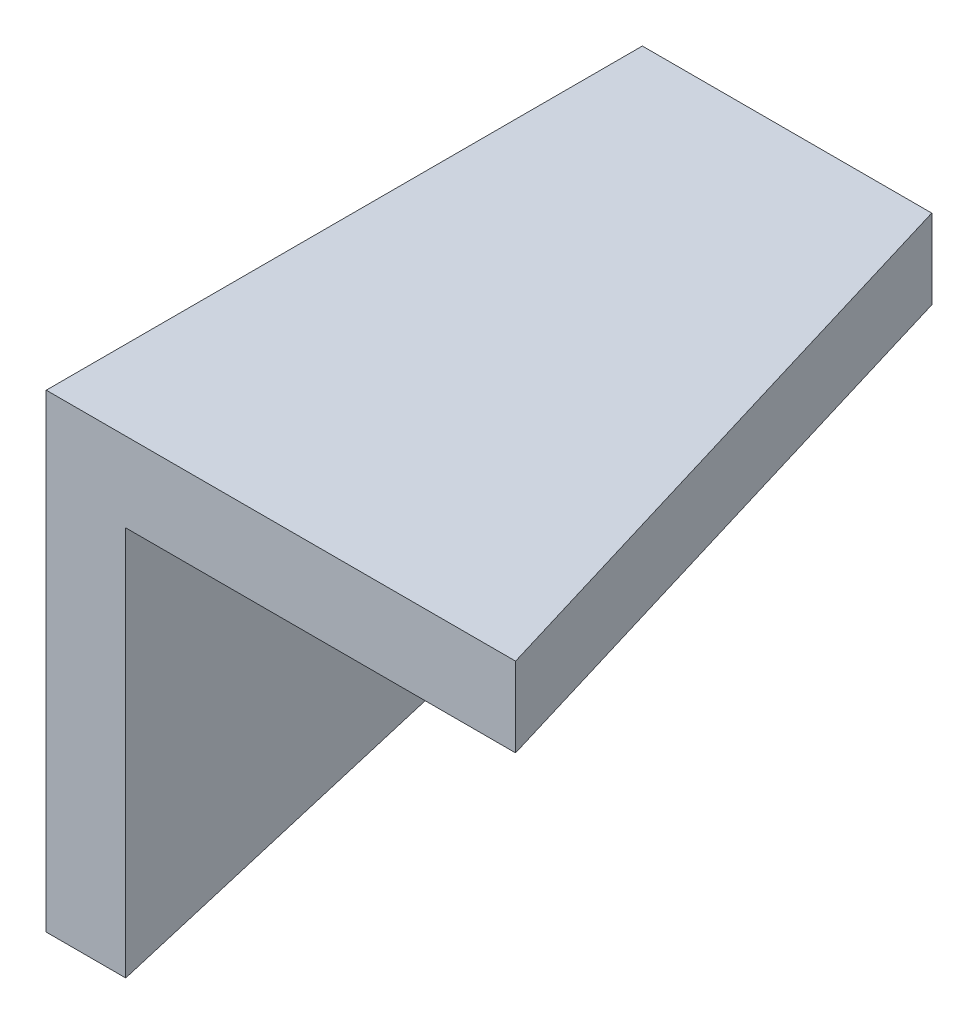
ISO-10303-21;
HEADER;
FILE_DESCRIPTION(('STEP AP214'),'2;1');
FILE_NAME('part.step','',(''),(''),'','','');
FILE_SCHEMA(('AUTOMOTIVE_DESIGN { 1 0 10303 214 1 1 1 1 }'));
ENDSEC;
DATA;
#1=APPLICATION_CONTEXT('core data for automotive mechanical design processes');
#2=APPLICATION_PROTOCOL_DEFINITION('international standard','automotive_design',2000,#1);
#3=PRODUCT_CONTEXT('',#1,'mechanical');
#4=PRODUCT('Part','Part','',(#3));
#5=PRODUCT_RELATED_PRODUCT_CATEGORY('part','',(#4));
#6=PRODUCT_DEFINITION_FORMATION('','',#4);
#7=PRODUCT_DEFINITION_CONTEXT('part definition',#1,'design');
#8=PRODUCT_DEFINITION('design','',#6,#7);
#9=PRODUCT_DEFINITION_SHAPE('','',#8);
#10=(LENGTH_UNIT() NAMED_UNIT(*) SI_UNIT(.MILLI.,.METRE.));
#11=(NAMED_UNIT(*) PLANE_ANGLE_UNIT() SI_UNIT($,.RADIAN.));
#12=(NAMED_UNIT(*) SI_UNIT($,.STERADIAN.) SOLID_ANGLE_UNIT());
#13=UNCERTAINTY_MEASURE_WITH_UNIT(LENGTH_MEASURE(1.E-05),#10,'distance_accuracy_value','');
#14=(GEOMETRIC_REPRESENTATION_CONTEXT(3) GLOBAL_UNCERTAINTY_ASSIGNED_CONTEXT((#13)) GLOBAL_UNIT_ASSIGNED_CONTEXT((#10,
#11,#12)) REPRESENTATION_CONTEXT('',''));
#15=CARTESIAN_POINT('',(0.,0.,0.));
#16=DIRECTION('',(0.,0.,1.));
#17=DIRECTION('',(1.,0.,0.));
#18=AXIS2_PLACEMENT_3D('',#15,#16,#17);
#19=CARTESIAN_POINT('',(40.,8.,30.));
#20=DIRECTION('',(0.,-1.,0.));
#21=DIRECTION('',(0.,0.,-1.));
#22=AXIS2_PLACEMENT_3D('',#19,#20,#21);
#23=PLANE('',#22);
#24=DIRECTION('',(-1.,0.,0.));
#25=VECTOR('',#24,1.);
#26=CARTESIAN_POINT('',(40.,8.,30.));
#27=LINE('',#26,#25);
#28=CARTESIAN_POINT('',(39.2402430588096,8.,30.));
#29=VERTEX_POINT('',#28);
#30=CARTESIAN_POINT('',(-8.,8.,30.));
#31=VERTEX_POINT('',#30);
#32=EDGE_CURVE('E139',#29,#31,#27,.T.);
#33=ORIENTED_EDGE('',*,*,#32,.F.);
#34=DIRECTION('',(-0.288970576767616,0.,-0.957337978857306));
#35=VECTOR('',#34,1.);
#36=CARTESIAN_POINT('',(39.3036857980486,8.,30.2101810656144));
#37=LINE('',#36,#35);
#38=CARTESIAN_POINT('',(21.1293616470514,8.,-30.));
#39=VERTEX_POINT('',#38);
#40=EDGE_CURVE('E136',#29,#39,#37,.T.);
#41=ORIENTED_EDGE('',*,*,#40,.T.);
#42=DIRECTION('',(-1.,0.,0.));
#43=VECTOR('',#42,1.);
#44=CARTESIAN_POINT('',(40.,8.,-30.));
#45=LINE('',#44,#43);
#46=CARTESIAN_POINT('',(-8.,8.,-30.));
#47=VERTEX_POINT('',#46);
#48=EDGE_CURVE('E138',#39,#47,#45,.T.);
#49=ORIENTED_EDGE('',*,*,#48,.T.);
#50=DIRECTION('',(0.,0.,-1.));
#51=VECTOR('',#50,1.);
#52=CARTESIAN_POINT('',(-8.,8.,30.));
#53=LINE('',#52,#51);
#54=EDGE_CURVE('E120',#31,#47,#53,.T.);
#55=ORIENTED_EDGE('',*,*,#54,.F.);
#56=EDGE_LOOP('',(#33,#41,#49,#55));
#57=FACE_BOUND('',#56,.T.);
#58=ADVANCED_FACE('F47',(#57),#23,.F.);
#59=CARTESIAN_POINT('',(40.,0.,30.));
#60=DIRECTION('',(0.,1.,0.));
#61=DIRECTION('',(0.,0.,1.));
#62=AXIS2_PLACEMENT_3D('',#59,#60,#61);
#63=PLANE('',#62);
#64=DIRECTION('',(1.,0.,0.));
#65=VECTOR('',#64,1.);
#66=CARTESIAN_POINT('',(40.,0.,-30.));
#67=LINE('',#66,#65);
#68=CARTESIAN_POINT('',(0.,0.,-30.));
#69=VERTEX_POINT('',#68);
#70=CARTESIAN_POINT('',(21.1293616470514,0.,-30.));
#71=VERTEX_POINT('',#70);
#72=EDGE_CURVE('E141',#69,#71,#67,.T.);
#73=ORIENTED_EDGE('',*,*,#72,.T.);
#74=DIRECTION('',(-0.288970576767616,0.,-0.957337978857306));
#75=VECTOR('',#74,1.);
#76=CARTESIAN_POINT('',(39.2402430588096,0.,30.));
#77=LINE('',#76,#75);
#78=CARTESIAN_POINT('',(39.2402430588096,0.,30.));
#79=VERTEX_POINT('',#78);
#80=EDGE_CURVE('E61',#79,#71,#77,.T.);
#81=ORIENTED_EDGE('',*,*,#80,.F.);
#82=DIRECTION('',(1.,0.,0.));
#83=VECTOR('',#82,1.);
#84=CARTESIAN_POINT('',(40.,0.,30.));
#85=LINE('',#84,#83);
#86=CARTESIAN_POINT('',(0.,0.,30.));
#87=VERTEX_POINT('',#86);
#88=EDGE_CURVE('E54',#87,#79,#85,.T.);
#89=ORIENTED_EDGE('',*,*,#88,.F.);
#90=DIRECTION('',(0.,0.,-1.));
#91=VECTOR('',#90,1.);
#92=CARTESIAN_POINT('',(0.,0.,30.));
#93=LINE('',#92,#91);
#94=EDGE_CURVE('E118',#87,#69,#93,.T.);
#95=ORIENTED_EDGE('',*,*,#94,.T.);
#96=EDGE_LOOP('',(#73,#81,#89,#95));
#97=FACE_BOUND('',#96,.T.);
#98=ADVANCED_FACE('F146',(#97),#63,.F.);
#99=CARTESIAN_POINT('',(0.,0.,30.));
#100=DIRECTION('',(0.,0.,1.));
#101=DIRECTION('',(1.,0.,0.));
#102=AXIS2_PLACEMENT_3D('',#99,#100,#101);
#103=PLANE('',#102);
#104=ORIENTED_EDGE('',*,*,#32,.T.);
#105=DIRECTION('',(0.,1.,0.));
#106=VECTOR('',#105,1.);
#107=CARTESIAN_POINT('',(-8.00000000000001,-40.,30.));
#108=LINE('',#107,#106);
#109=CARTESIAN_POINT('',(-8.00000000000001,-39.2402430588096,30.));
#110=VERTEX_POINT('',#109);
#111=EDGE_CURVE('E103',#110,#31,#108,.T.);
#112=ORIENTED_EDGE('',*,*,#111,.F.);
#113=DIRECTION('',(1.,0.,0.));
#114=VECTOR('',#113,1.);
#115=CARTESIAN_POINT('',(-10.,-39.2402430588096,30.));
#116=LINE('',#115,#114);
#117=CARTESIAN_POINT('',(0.,-39.2402430588096,30.));
#118=VERTEX_POINT('',#117);
#119=EDGE_CURVE('E95',#110,#118,#116,.T.);
#120=ORIENTED_EDGE('',*,*,#119,.T.);
#121=DIRECTION('',(0.,-1.,0.));
#122=VECTOR('',#121,1.);
#123=CARTESIAN_POINT('',(0.,-40.,30.));
#124=LINE('',#123,#122);
#125=EDGE_CURVE('E100',#87,#118,#124,.T.);
#126=ORIENTED_EDGE('',*,*,#125,.F.);
#127=ORIENTED_EDGE('',*,*,#88,.T.);
#128=DIRECTION('',(0.,-1.,0.));
#129=VECTOR('',#128,1.);
#130=CARTESIAN_POINT('',(39.2402430588096,10.,30.));
#131=LINE('',#130,#129);
#132=EDGE_CURVE('E134',#29,#79,#131,.T.);
#133=ORIENTED_EDGE('',*,*,#132,.F.);
#134=EDGE_LOOP('',(#104,#112,#120,#126,#127,#133));
#135=FACE_BOUND('',#134,.T.);
#136=ADVANCED_FACE('F97',(#135),#103,.T.);
#137=CARTESIAN_POINT('',(0.,0.,-30.));
#138=DIRECTION('',(0.,0.,1.));
#139=DIRECTION('',(1.,0.,0.));
#140=AXIS2_PLACEMENT_3D('',#137,#138,#139);
#141=PLANE('',#140);
#142=ORIENTED_EDGE('',*,*,#72,.F.);
#143=DIRECTION('',(0.,-1.,0.));
#144=VECTOR('',#143,1.);
#145=CARTESIAN_POINT('',(0.,-40.,-30.));
#146=LINE('',#145,#144);
#147=CARTESIAN_POINT('',(0.,-21.1293616470514,-30.));
#148=VERTEX_POINT('',#147);
#149=EDGE_CURVE('E122',#69,#148,#146,.T.);
#150=ORIENTED_EDGE('',*,*,#149,.T.);
#151=DIRECTION('',(1.,0.,0.));
#152=VECTOR('',#151,1.);
#153=CARTESIAN_POINT('',(0.,-21.1293616470514,-30.));
#154=LINE('',#153,#152);
#155=CARTESIAN_POINT('',(-8.00000000000001,-21.1293616470514,-30.));
#156=VERTEX_POINT('',#155);
#157=EDGE_CURVE('E112',#156,#148,#154,.T.);
#158=ORIENTED_EDGE('',*,*,#157,.F.);
#159=DIRECTION('',(0.,1.,0.));
#160=VECTOR('',#159,1.);
#161=CARTESIAN_POINT('',(-8.00000000000001,-40.,-30.));
#162=LINE('',#161,#160);
#163=EDGE_CURVE('E126',#156,#47,#162,.T.);
#164=ORIENTED_EDGE('',*,*,#163,.T.);
#165=ORIENTED_EDGE('',*,*,#48,.F.);
#166=DIRECTION('',(0.,-1.,0.));
#167=VECTOR('',#166,1.);
#168=CARTESIAN_POINT('',(21.1293616470514,0.,-30.));
#169=LINE('',#168,#167);
#170=EDGE_CURVE('E11',#39,#71,#169,.T.);
#171=ORIENTED_EDGE('',*,*,#170,.T.);
#172=EDGE_LOOP('',(#142,#150,#158,#164,#165,#171));
#173=FACE_BOUND('',#172,.T.);
#174=ADVANCED_FACE('F148',(#173),#141,.F.);
#175=CARTESIAN_POINT('',(39.2402430588096,10.,30.));
#176=DIRECTION('',(-0.957337978857306,0.,0.288970576767616));
#177=DIRECTION('',(0.288970576767616,0.,0.957337978857306));
#178=AXIS2_PLACEMENT_3D('',#175,#176,#177);
#179=PLANE('',#178);
#180=ORIENTED_EDGE('',*,*,#132,.T.);
#181=ORIENTED_EDGE('',*,*,#80,.T.);
#182=ORIENTED_EDGE('',*,*,#170,.F.);
#183=ORIENTED_EDGE('',*,*,#40,.F.);
#184=EDGE_LOOP('',(#180,#181,#182,#183));
#185=FACE_BOUND('',#184,.T.);
#186=ADVANCED_FACE('F155',(#185),#179,.F.);
#187=CARTESIAN_POINT('',(-8.00000000000001,-40.,30.));
#188=DIRECTION('',(1.,0.,0.));
#189=DIRECTION('',(0.,0.,-1.));
#190=AXIS2_PLACEMENT_3D('',#187,#188,#189);
#191=PLANE('',#190);
#192=ORIENTED_EDGE('',*,*,#111,.T.);
#193=ORIENTED_EDGE('',*,*,#54,.T.);
#194=ORIENTED_EDGE('',*,*,#163,.F.);
#195=DIRECTION('',(0.,0.288970576767616,-0.957337978857306));
#196=VECTOR('',#195,1.);
#197=CARTESIAN_POINT('',(-8.00000000000001,-39.3036857980486,30.2101810656144));
#198=LINE('',#197,#196);
#199=EDGE_CURVE('E107',#110,#156,#198,.T.);
#200=ORIENTED_EDGE('',*,*,#199,.F.);
#201=EDGE_LOOP('',(#192,#193,#194,#200));
#202=FACE_BOUND('',#201,.T.);
#203=ADVANCED_FACE('F157',(#202),#191,.F.);
#204=CARTESIAN_POINT('',(0.,-40.,30.));
#205=DIRECTION('',(-1.,0.,0.));
#206=DIRECTION('',(0.,0.,1.));
#207=AXIS2_PLACEMENT_3D('',#204,#205,#206);
#208=PLANE('',#207);
#209=ORIENTED_EDGE('',*,*,#149,.F.);
#210=ORIENTED_EDGE('',*,*,#94,.F.);
#211=ORIENTED_EDGE('',*,*,#125,.T.);
#212=DIRECTION('',(0.,0.288970576767616,-0.957337978857306));
#213=VECTOR('',#212,1.);
#214=CARTESIAN_POINT('',(0.,-39.2402430588096,30.));
#215=LINE('',#214,#213);
#216=EDGE_CURVE('E108',#118,#148,#215,.T.);
#217=ORIENTED_EDGE('',*,*,#216,.T.);
#218=EDGE_LOOP('',(#209,#210,#211,#217));
#219=FACE_BOUND('',#218,.T.);
#220=ADVANCED_FACE('F117',(#219),#208,.F.);
#221=CARTESIAN_POINT('',(-10.,-39.2402430588096,30.));
#222=DIRECTION('',(0.,0.957337978857306,0.288970576767616));
#223=DIRECTION('',(0.,-0.288970576767616,0.957337978857306));
#224=AXIS2_PLACEMENT_3D('',#221,#222,#223);
#225=PLANE('',#224);
#226=ORIENTED_EDGE('',*,*,#119,.F.);
#227=ORIENTED_EDGE('',*,*,#199,.T.);
#228=ORIENTED_EDGE('',*,*,#157,.T.);
#229=ORIENTED_EDGE('',*,*,#216,.F.);
#230=EDGE_LOOP('',(#226,#227,#228,#229));
#231=FACE_BOUND('',#230,.T.);
#232=ADVANCED_FACE('F111',(#231),#225,.F.);
#233=CLOSED_SHELL('',(#58,#98,#136,#174,#186,#203,#220,#232));
#234=MANIFOLD_SOLID_BREP('B2',#233);
#235=ADVANCED_BREP_SHAPE_REPRESENTATION('',(#18,#234),#14);
#236=SHAPE_DEFINITION_REPRESENTATION(#9,#235);
ENDSEC;
END-ISO-10303-21;
